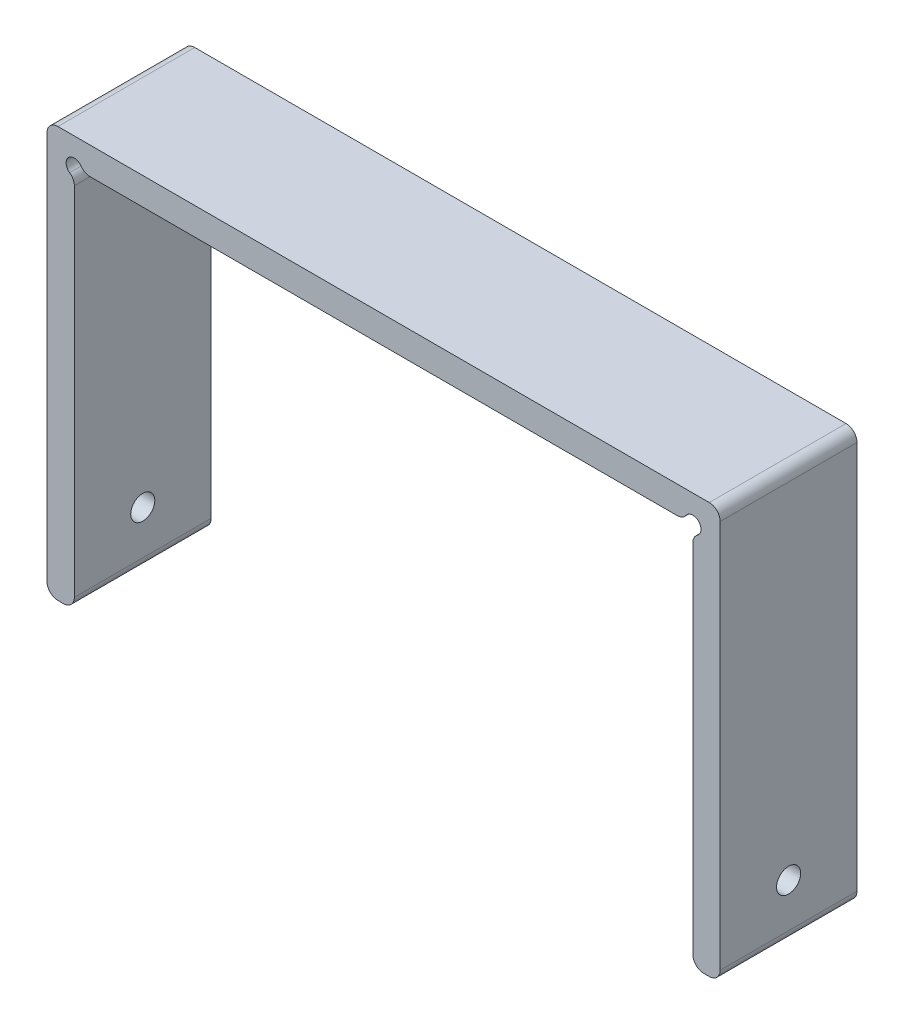
ISO-10303-21;
HEADER;
FILE_DESCRIPTION(('STEP AP214'),'2;1');
FILE_NAME('part.step','',(''),(''),'','','');
FILE_SCHEMA(('AUTOMOTIVE_DESIGN { 1 0 10303 214 1 1 1 1 }'));
ENDSEC;
DATA;
#1=APPLICATION_CONTEXT('core data for automotive mechanical design processes');
#2=APPLICATION_PROTOCOL_DEFINITION('international standard','automotive_design',2000,#1);
#3=PRODUCT_CONTEXT('',#1,'mechanical');
#4=PRODUCT('Part','Part','',(#3));
#5=PRODUCT_RELATED_PRODUCT_CATEGORY('part','',(#4));
#6=PRODUCT_DEFINITION_FORMATION('','',#4);
#7=PRODUCT_DEFINITION_CONTEXT('part definition',#1,'design');
#8=PRODUCT_DEFINITION('design','',#6,#7);
#9=PRODUCT_DEFINITION_SHAPE('','',#8);
#10=(LENGTH_UNIT() NAMED_UNIT(*) SI_UNIT(.MILLI.,.METRE.));
#11=(NAMED_UNIT(*) PLANE_ANGLE_UNIT() SI_UNIT($,.RADIAN.));
#12=(NAMED_UNIT(*) SI_UNIT($,.STERADIAN.) SOLID_ANGLE_UNIT());
#13=UNCERTAINTY_MEASURE_WITH_UNIT(LENGTH_MEASURE(1.E-05),#10,'distance_accuracy_value','');
#14=(GEOMETRIC_REPRESENTATION_CONTEXT(3) GLOBAL_UNCERTAINTY_ASSIGNED_CONTEXT((#13)) GLOBAL_UNIT_ASSIGNED_CONTEXT((#10,
#11,#12)) REPRESENTATION_CONTEXT('',''));
#15=CARTESIAN_POINT('',(0.,0.,0.));
#16=DIRECTION('',(0.,0.,1.));
#17=DIRECTION('',(1.,0.,0.));
#18=AXIS2_PLACEMENT_3D('',#15,#16,#17);
#19=CARTESIAN_POINT('',(0.,0.,25.));
#20=DIRECTION('',(0.,1.,0.));
#21=DIRECTION('',(-1.,0.,0.));
#22=AXIS2_PLACEMENT_3D('',#19,#20,#21);
#23=PLANE('',#22);
#24=DIRECTION('',(1.,0.,0.));
#25=VECTOR('',#24,1.);
#26=CARTESIAN_POINT('',(0.,0.,25.));
#27=LINE('',#26,#25);
#28=CARTESIAN_POINT('',(2.,0.,25.));
#29=VERTEX_POINT('',#28);
#30=CARTESIAN_POINT('',(3.,0.,25.));
#31=VERTEX_POINT('',#30);
#32=EDGE_CURVE('E226',#29,#31,#27,.T.);
#33=ORIENTED_EDGE('',*,*,#32,.F.);
#34=DIRECTION('',(0.,0.,-1.));
#35=VECTOR('',#34,1.);
#36=CARTESIAN_POINT('',(2.,0.,25.));
#37=LINE('',#36,#35);
#38=CARTESIAN_POINT('',(2.,0.,0.));
#39=VERTEX_POINT('',#38);
#40=EDGE_CURVE('E283',#29,#39,#37,.T.);
#41=ORIENTED_EDGE('',*,*,#40,.T.);
#42=DIRECTION('',(1.,0.,0.));
#43=VECTOR('',#42,1.);
#44=CARTESIAN_POINT('',(0.,0.,0.));
#45=LINE('',#44,#43);
#46=CARTESIAN_POINT('',(3.,0.,0.));
#47=VERTEX_POINT('',#46);
#48=EDGE_CURVE('E203',#39,#47,#45,.T.);
#49=ORIENTED_EDGE('',*,*,#48,.T.);
#50=DIRECTION('',(0.,0.,-1.));
#51=VECTOR('',#50,1.);
#52=CARTESIAN_POINT('',(3.,0.,25.));
#53=LINE('',#52,#51);
#54=EDGE_CURVE('E179',#47,#31,#53,.F.);
#55=ORIENTED_EDGE('',*,*,#54,.T.);
#56=EDGE_LOOP('',(#33,#41,#49,#55));
#57=FACE_BOUND('',#56,.T.);
#58=ADVANCED_FACE('F37',(#57),#23,.F.);
#59=CARTESIAN_POINT('',(5.,0.,25.));
#60=DIRECTION('',(-1.,0.,0.));
#61=DIRECTION('',(0.,-1.,0.));
#62=AXIS2_PLACEMENT_3D('',#59,#60,#61);
#63=PLANE('',#62);
#64=CARTESIAN_POINT('',(5.,10.,12.5));
#65=DIRECTION('',(-1.,0.,0.));
#66=DIRECTION('',(0.,-1.,0.));
#67=AXIS2_PLACEMENT_3D('',#64,#65,#66);
#68=CIRCLE('',#67,2.2);
#69=CARTESIAN_POINT('',(5.,7.8,12.5));
#70=VERTEX_POINT('',#69);
#71=EDGE_CURVE('E208',#70,#70,#68,.T.);
#72=ORIENTED_EDGE('',*,*,#71,.T.);
#73=EDGE_LOOP('',(#72));
#74=FACE_BOUND('',#73,.T.);
#75=DIRECTION('',(0.,1.,0.));
#76=VECTOR('',#75,1.);
#77=CARTESIAN_POINT('',(5.,0.,0.));
#78=LINE('',#77,#76);
#79=CARTESIAN_POINT('',(5.,2.,0.));
#80=VERTEX_POINT('',#79);
#81=CARTESIAN_POINT('',(4.99999999999999,67.127718676731,0.));
#82=VERTEX_POINT('',#81);
#83=EDGE_CURVE('E191',#80,#82,#78,.T.);
#84=ORIENTED_EDGE('',*,*,#83,.T.);
#85=DIRECTION('',(0.,0.,1.));
#86=VECTOR('',#85,1.);
#87=CARTESIAN_POINT('',(4.99999999999999,67.127718676731,25.));
#88=LINE('',#87,#86);
#89=CARTESIAN_POINT('',(4.99999999999999,67.127718676731,25.));
#90=VERTEX_POINT('',#89);
#91=EDGE_CURVE('E195',#82,#90,#88,.T.);
#92=ORIENTED_EDGE('',*,*,#91,.T.);
#93=DIRECTION('',(0.,1.,0.));
#94=VECTOR('',#93,1.);
#95=CARTESIAN_POINT('',(5.,0.,25.));
#96=LINE('',#95,#94);
#97=CARTESIAN_POINT('',(5.,2.,25.));
#98=VERTEX_POINT('',#97);
#99=EDGE_CURVE('E194',#98,#90,#96,.T.);
#100=ORIENTED_EDGE('',*,*,#99,.F.);
#101=DIRECTION('',(0.,0.,-1.));
#102=VECTOR('',#101,1.);
#103=CARTESIAN_POINT('',(5.,2.,25.));
#104=LINE('',#103,#102);
#105=EDGE_CURVE('E178',#98,#80,#104,.T.);
#106=ORIENTED_EDGE('',*,*,#105,.T.);
#107=EDGE_LOOP('',(#84,#92,#100,#106));
#108=FACE_BOUND('',#107,.T.);
#109=ADVANCED_FACE('F189',(#74,#108),#63,.F.);
#110=CARTESIAN_POINT('',(4.99999999999999,70.,25.));
#111=DIRECTION('',(0.,1.,0.));
#112=DIRECTION('',(0.,0.,1.));
#113=AXIS2_PLACEMENT_3D('',#110,#111,#112);
#114=PLANE('',#113);
#115=DIRECTION('',(1.,0.,0.));
#116=VECTOR('',#115,1.);
#117=CARTESIAN_POINT('',(4.99999999999999,70.,0.));
#118=LINE('',#117,#116);
#119=CARTESIAN_POINT('',(7.872281323269,70.,0.));
#120=VERTEX_POINT('',#119);
#121=CARTESIAN_POINT('',(115.127718676731,70.,0.));
#122=VERTEX_POINT('',#121);
#123=EDGE_CURVE('E202',#120,#122,#118,.T.);
#124=ORIENTED_EDGE('',*,*,#123,.T.);
#125=DIRECTION('',(0.,0.,1.));
#126=VECTOR('',#125,1.);
#127=CARTESIAN_POINT('',(115.127718676731,70.,25.));
#128=LINE('',#127,#126);
#129=CARTESIAN_POINT('',(115.127718676731,70.,25.));
#130=VERTEX_POINT('',#129);
#131=EDGE_CURVE('E271',#122,#130,#128,.T.);
#132=ORIENTED_EDGE('',*,*,#131,.T.);
#133=DIRECTION('',(1.,0.,0.));
#134=VECTOR('',#133,1.);
#135=CARTESIAN_POINT('',(4.99999999999999,70.,25.));
#136=LINE('',#135,#134);
#137=CARTESIAN_POINT('',(7.872281323269,70.,25.));
#138=VERTEX_POINT('',#137);
#139=EDGE_CURVE('E403',#138,#130,#136,.T.);
#140=ORIENTED_EDGE('',*,*,#139,.F.);
#141=DIRECTION('',(0.,0.,1.));
#142=VECTOR('',#141,1.);
#143=CARTESIAN_POINT('',(7.872281323269,70.,25.));
#144=LINE('',#143,#142);
#145=EDGE_CURVE('E268',#138,#120,#144,.F.);
#146=ORIENTED_EDGE('',*,*,#145,.T.);
#147=EDGE_LOOP('',(#124,#132,#140,#146));
#148=FACE_BOUND('',#147,.T.);
#149=ADVANCED_FACE('F371',(#148),#114,.F.);
#150=CARTESIAN_POINT('',(118.,70.,25.));
#151=DIRECTION('',(1.,0.,0.));
#152=DIRECTION('',(0.,0.,-1.));
#153=AXIS2_PLACEMENT_3D('',#150,#151,#152);
#154=PLANE('',#153);
#155=CARTESIAN_POINT('',(118.,10.,12.5));
#156=DIRECTION('',(1.,0.,0.));
#157=DIRECTION('',(0.,0.,-1.));
#158=AXIS2_PLACEMENT_3D('',#155,#156,#157);
#159=CIRCLE('',#158,2.2);
#160=CARTESIAN_POINT('',(118.,10.,10.3));
#161=VERTEX_POINT('',#160);
#162=EDGE_CURVE('E411',#161,#161,#159,.T.);
#163=ORIENTED_EDGE('',*,*,#162,.T.);
#164=EDGE_LOOP('',(#163));
#165=FACE_BOUND('',#164,.T.);
#166=DIRECTION('',(0.,-1.,0.));
#167=VECTOR('',#166,1.);
#168=CARTESIAN_POINT('',(118.,70.,25.));
#169=LINE('',#168,#167);
#170=CARTESIAN_POINT('',(118.,67.127718676731,25.));
#171=VERTEX_POINT('',#170);
#172=CARTESIAN_POINT('',(118.,2.,25.));
#173=VERTEX_POINT('',#172);
#174=EDGE_CURVE('E328',#171,#173,#169,.T.);
#175=ORIENTED_EDGE('',*,*,#174,.F.);
#176=DIRECTION('',(0.,0.,1.));
#177=VECTOR('',#176,1.);
#178=CARTESIAN_POINT('',(118.,67.127718676731,25.));
#179=LINE('',#178,#177);
#180=CARTESIAN_POINT('',(118.,67.127718676731,0.));
#181=VERTEX_POINT('',#180);
#182=EDGE_CURVE('E279',#171,#181,#179,.F.);
#183=ORIENTED_EDGE('',*,*,#182,.T.);
#184=DIRECTION('',(0.,-1.,0.));
#185=VECTOR('',#184,1.);
#186=CARTESIAN_POINT('',(118.,70.,0.));
#187=LINE('',#186,#185);
#188=CARTESIAN_POINT('',(118.,2.,0.));
#189=VERTEX_POINT('',#188);
#190=EDGE_CURVE('E206',#181,#189,#187,.T.);
#191=ORIENTED_EDGE('',*,*,#190,.T.);
#192=DIRECTION('',(0.,0.,-1.));
#193=VECTOR('',#192,1.);
#194=CARTESIAN_POINT('',(118.,2.,25.));
#195=LINE('',#194,#193);
#196=EDGE_CURVE('E277',#189,#173,#195,.F.);
#197=ORIENTED_EDGE('',*,*,#196,.T.);
#198=EDGE_LOOP('',(#175,#183,#191,#197));
#199=FACE_BOUND('',#198,.T.);
#200=ADVANCED_FACE('F401',(#165,#199),#154,.F.);
#201=CARTESIAN_POINT('',(123.,0.,25.));
#202=DIRECTION('',(0.,1.,0.));
#203=DIRECTION('',(-1.,0.,0.));
#204=AXIS2_PLACEMENT_3D('',#201,#202,#203);
#205=PLANE('',#204);
#206=DIRECTION('',(1.,0.,0.));
#207=VECTOR('',#206,1.);
#208=CARTESIAN_POINT('',(123.,0.,0.));
#209=LINE('',#208,#207);
#210=CARTESIAN_POINT('',(120.,0.,0.));
#211=VERTEX_POINT('',#210);
#212=CARTESIAN_POINT('',(121.,0.,0.));
#213=VERTEX_POINT('',#212);
#214=EDGE_CURVE('E214',#211,#213,#209,.T.);
#215=ORIENTED_EDGE('',*,*,#214,.T.);
#216=DIRECTION('',(0.,0.,-1.));
#217=VECTOR('',#216,1.);
#218=CARTESIAN_POINT('',(121.,0.,25.));
#219=LINE('',#218,#217);
#220=CARTESIAN_POINT('',(121.,0.,25.));
#221=VERTEX_POINT('',#220);
#222=EDGE_CURVE('E11',#213,#221,#219,.F.);
#223=ORIENTED_EDGE('',*,*,#222,.T.);
#224=DIRECTION('',(1.,0.,0.));
#225=VECTOR('',#224,1.);
#226=CARTESIAN_POINT('',(123.,0.,25.));
#227=LINE('',#226,#225);
#228=CARTESIAN_POINT('',(120.,0.,25.));
#229=VERTEX_POINT('',#228);
#230=EDGE_CURVE('E308',#229,#221,#227,.T.);
#231=ORIENTED_EDGE('',*,*,#230,.F.);
#232=DIRECTION('',(0.,0.,-1.));
#233=VECTOR('',#232,1.);
#234=CARTESIAN_POINT('',(120.,0.,25.));
#235=LINE('',#234,#233);
#236=EDGE_CURVE('E45',#229,#211,#235,.T.);
#237=ORIENTED_EDGE('',*,*,#236,.T.);
#238=EDGE_LOOP('',(#215,#223,#231,#237));
#239=FACE_BOUND('',#238,.T.);
#240=ADVANCED_FACE('F305',(#239),#205,.F.);
#241=CARTESIAN_POINT('',(123.,75.,25.));
#242=DIRECTION('',(-1.,0.,0.));
#243=DIRECTION('',(0.,0.,1.));
#244=AXIS2_PLACEMENT_3D('',#241,#242,#243);
#245=PLANE('',#244);
#246=CARTESIAN_POINT('',(123.,10.,12.5));
#247=DIRECTION('',(1.,0.,0.));
#248=DIRECTION('',(0.,0.,-1.));
#249=AXIS2_PLACEMENT_3D('',#246,#247,#248);
#250=CIRCLE('',#249,2.2);
#251=CARTESIAN_POINT('',(123.,10.,10.3));
#252=VERTEX_POINT('',#251);
#253=EDGE_CURVE('E415',#252,#252,#250,.T.);
#254=ORIENTED_EDGE('',*,*,#253,.F.);
#255=EDGE_LOOP('',(#254));
#256=FACE_BOUND('',#255,.T.);
#257=DIRECTION('',(0.,1.,0.));
#258=VECTOR('',#257,1.);
#259=CARTESIAN_POINT('',(123.,75.,0.));
#260=LINE('',#259,#258);
#261=CARTESIAN_POINT('',(123.,2.,0.));
#262=VERTEX_POINT('',#261);
#263=CARTESIAN_POINT('',(123.,73.,0.));
#264=VERTEX_POINT('',#263);
#265=EDGE_CURVE('E217',#262,#264,#260,.T.);
#266=ORIENTED_EDGE('',*,*,#265,.T.);
#267=DIRECTION('',(0.,0.,-1.));
#268=VECTOR('',#267,1.);
#269=CARTESIAN_POINT('',(123.,73.,25.));
#270=LINE('',#269,#268);
#271=CARTESIAN_POINT('',(123.,73.,25.));
#272=VERTEX_POINT('',#271);
#273=EDGE_CURVE('E299',#264,#272,#270,.F.);
#274=ORIENTED_EDGE('',*,*,#273,.T.);
#275=DIRECTION('',(0.,1.,0.));
#276=VECTOR('',#275,1.);
#277=CARTESIAN_POINT('',(123.,75.,25.));
#278=LINE('',#277,#276);
#279=CARTESIAN_POINT('',(123.,2.,25.));
#280=VERTEX_POINT('',#279);
#281=EDGE_CURVE('E321',#280,#272,#278,.T.);
#282=ORIENTED_EDGE('',*,*,#281,.F.);
#283=DIRECTION('',(0.,0.,-1.));
#284=VECTOR('',#283,1.);
#285=CARTESIAN_POINT('',(123.,2.,25.));
#286=LINE('',#285,#284);
#287=EDGE_CURVE('E296',#280,#262,#286,.T.);
#288=ORIENTED_EDGE('',*,*,#287,.T.);
#289=EDGE_LOOP('',(#266,#274,#282,#288));
#290=FACE_BOUND('',#289,.T.);
#291=ADVANCED_FACE('F318',(#256,#290),#245,.F.);
#292=CARTESIAN_POINT('',(0.,75.,25.));
#293=DIRECTION('',(0.,-1.,0.));
#294=DIRECTION('',(0.,0.,-1.));
#295=AXIS2_PLACEMENT_3D('',#292,#293,#294);
#296=PLANE('',#295);
#297=DIRECTION('',(-1.,0.,0.));
#298=VECTOR('',#297,1.);
#299=CARTESIAN_POINT('',(0.,75.,25.));
#300=LINE('',#299,#298);
#301=CARTESIAN_POINT('',(121.,75.,25.));
#302=VERTEX_POINT('',#301);
#303=CARTESIAN_POINT('',(1.99999999999999,75.,25.));
#304=VERTEX_POINT('',#303);
#305=EDGE_CURVE('E324',#302,#304,#300,.T.);
#306=ORIENTED_EDGE('',*,*,#305,.F.);
#307=DIRECTION('',(0.,0.,-1.));
#308=VECTOR('',#307,1.);
#309=CARTESIAN_POINT('',(121.,75.,25.));
#310=LINE('',#309,#308);
#311=CARTESIAN_POINT('',(121.,75.,0.));
#312=VERTEX_POINT('',#311);
#313=EDGE_CURVE('E293',#302,#312,#310,.T.);
#314=ORIENTED_EDGE('',*,*,#313,.T.);
#315=DIRECTION('',(-1.,0.,0.));
#316=VECTOR('',#315,1.);
#317=CARTESIAN_POINT('',(0.,75.,0.));
#318=LINE('',#317,#316);
#319=CARTESIAN_POINT('',(1.99999999999999,75.,0.));
#320=VERTEX_POINT('',#319);
#321=EDGE_CURVE('E220',#312,#320,#318,.T.);
#322=ORIENTED_EDGE('',*,*,#321,.T.);
#323=DIRECTION('',(0.,0.,-1.));
#324=VECTOR('',#323,1.);
#325=CARTESIAN_POINT('',(1.99999999999999,75.,25.));
#326=LINE('',#325,#324);
#327=EDGE_CURVE('E291',#320,#304,#326,.F.);
#328=ORIENTED_EDGE('',*,*,#327,.T.);
#329=EDGE_LOOP('',(#306,#314,#322,#328));
#330=FACE_BOUND('',#329,.T.);
#331=ADVANCED_FACE('F352',(#330),#296,.F.);
#332=CARTESIAN_POINT('',(0.,0.,25.));
#333=DIRECTION('',(1.,0.,0.));
#334=DIRECTION('',(0.,1.,0.));
#335=AXIS2_PLACEMENT_3D('',#332,#333,#334);
#336=PLANE('',#335);
#337=CARTESIAN_POINT('',(0.,10.,12.5));
#338=DIRECTION('',(1.,0.,0.));
#339=DIRECTION('',(0.,0.,-1.));
#340=AXIS2_PLACEMENT_3D('',#337,#338,#339);
#341=CIRCLE('',#340,2.2);
#342=CARTESIAN_POINT('',(0.,10.,10.3));
#343=VERTEX_POINT('',#342);
#344=EDGE_CURVE('E414',#343,#343,#341,.T.);
#345=ORIENTED_EDGE('',*,*,#344,.T.);
#346=EDGE_LOOP('',(#345));
#347=FACE_BOUND('',#346,.T.);
#348=DIRECTION('',(0.,-1.,0.));
#349=VECTOR('',#348,1.);
#350=CARTESIAN_POINT('',(0.,0.,0.));
#351=LINE('',#350,#349);
#352=CARTESIAN_POINT('',(0.,73.,0.));
#353=VERTEX_POINT('',#352);
#354=CARTESIAN_POINT('',(0.,2.,0.));
#355=VERTEX_POINT('',#354);
#356=EDGE_CURVE('E223',#353,#355,#351,.T.);
#357=ORIENTED_EDGE('',*,*,#356,.T.);
#358=DIRECTION('',(0.,0.,-1.));
#359=VECTOR('',#358,1.);
#360=CARTESIAN_POINT('',(0.,2.,25.));
#361=LINE('',#360,#359);
#362=CARTESIAN_POINT('',(0.,2.,25.));
#363=VERTEX_POINT('',#362);
#364=EDGE_CURVE('E289',#355,#363,#361,.F.);
#365=ORIENTED_EDGE('',*,*,#364,.T.);
#366=DIRECTION('',(0.,-1.,0.));
#367=VECTOR('',#366,1.);
#368=CARTESIAN_POINT('',(0.,0.,25.));
#369=LINE('',#368,#367);
#370=CARTESIAN_POINT('',(0.,73.,25.));
#371=VERTEX_POINT('',#370);
#372=EDGE_CURVE('E227',#371,#363,#369,.T.);
#373=ORIENTED_EDGE('',*,*,#372,.F.);
#374=DIRECTION('',(0.,0.,-1.));
#375=VECTOR('',#374,1.);
#376=CARTESIAN_POINT('',(0.,73.,25.));
#377=LINE('',#376,#375);
#378=EDGE_CURVE('E286',#371,#353,#377,.T.);
#379=ORIENTED_EDGE('',*,*,#378,.T.);
#380=EDGE_LOOP('',(#357,#365,#373,#379));
#381=FACE_BOUND('',#380,.T.);
#382=ADVANCED_FACE('F346',(#347,#381),#336,.F.);
#383=CARTESIAN_POINT('',(0.,0.,25.));
#384=DIRECTION('',(0.,0.,1.));
#385=DIRECTION('',(1.,0.,0.));
#386=AXIS2_PLACEMENT_3D('',#383,#384,#385);
#387=PLANE('',#386);
#388=ORIENTED_EDGE('',*,*,#99,.T.);
#389=CARTESIAN_POINT('',(2.99999999999999,67.127718676731,25.));
#390=DIRECTION('',(0.,0.,1.));
#391=DIRECTION('',(1.,0.,0.));
#392=AXIS2_PLACEMENT_3D('',#389,#390,#391);
#393=CIRCLE('',#392,2.);
#394=CARTESIAN_POINT('',(4.14285714285713,68.7690222900276,25.));
#395=VERTEX_POINT('',#394);
#396=EDGE_CURVE('E248',#90,#395,#393,.T.);
#397=ORIENTED_EDGE('',*,*,#396,.T.);
#398=CARTESIAN_POINT('',(4.99999999999999,70.,25.));
#399=DIRECTION('',(0.,0.,1.));
#400=DIRECTION('',(1.,0.,0.));
#401=AXIS2_PLACEMENT_3D('',#398,#399,#400);
#402=CIRCLE('',#401,1.5);
#403=CARTESIAN_POINT('',(6.23097770997242,70.8571428571429,25.));
#404=VERTEX_POINT('',#403);
#405=EDGE_CURVE('E422',#404,#395,#402,.T.);
#406=ORIENTED_EDGE('',*,*,#405,.F.);
#407=CARTESIAN_POINT('',(7.872281323269,72.,25.));
#408=DIRECTION('',(0.,0.,1.));
#409=DIRECTION('',(1.,0.,0.));
#410=AXIS2_PLACEMENT_3D('',#407,#408,#409);
#411=CIRCLE('',#410,2.);
#412=EDGE_CURVE('E244',#404,#138,#411,.T.);
#413=ORIENTED_EDGE('',*,*,#412,.T.);
#414=ORIENTED_EDGE('',*,*,#139,.T.);
#415=CARTESIAN_POINT('',(115.127718676731,72.,25.));
#416=DIRECTION('',(0.,0.,1.));
#417=DIRECTION('',(1.,0.,0.));
#418=AXIS2_PLACEMENT_3D('',#415,#416,#417);
#419=CIRCLE('',#418,2.);
#420=CARTESIAN_POINT('',(116.769022290028,70.8571428571429,25.));
#421=VERTEX_POINT('',#420);
#422=EDGE_CURVE('E246',#130,#421,#419,.T.);
#423=ORIENTED_EDGE('',*,*,#422,.T.);
#424=CARTESIAN_POINT('',(118.,70.,25.));
#425=DIRECTION('',(0.,0.,1.));
#426=DIRECTION('',(1.,0.,0.));
#427=AXIS2_PLACEMENT_3D('',#424,#425,#426);
#428=CIRCLE('',#427,1.5);
#429=CARTESIAN_POINT('',(118.857142857143,68.7690222900276,25.));
#430=VERTEX_POINT('',#429);
#431=EDGE_CURVE('E399',#430,#421,#428,.T.);
#432=ORIENTED_EDGE('',*,*,#431,.F.);
#433=CARTESIAN_POINT('',(120.,67.127718676731,25.));
#434=DIRECTION('',(0.,0.,1.));
#435=DIRECTION('',(1.,0.,0.));
#436=AXIS2_PLACEMENT_3D('',#433,#434,#435);
#437=CIRCLE('',#436,2.);
#438=EDGE_CURVE('E242',#430,#171,#437,.T.);
#439=ORIENTED_EDGE('',*,*,#438,.T.);
#440=ORIENTED_EDGE('',*,*,#174,.T.);
#441=CARTESIAN_POINT('',(120.,2.,25.));
#442=DIRECTION('',(0.,0.,1.));
#443=DIRECTION('',(1.,0.,0.));
#444=AXIS2_PLACEMENT_3D('',#441,#442,#443);
#445=CIRCLE('',#444,2.);
#446=EDGE_CURVE('E234',#173,#229,#445,.T.);
#447=ORIENTED_EDGE('',*,*,#446,.T.);
#448=ORIENTED_EDGE('',*,*,#230,.T.);
#449=CARTESIAN_POINT('',(121.,2.,25.));
#450=DIRECTION('',(0.,0.,1.));
#451=DIRECTION('',(1.,0.,0.));
#452=AXIS2_PLACEMENT_3D('',#449,#450,#451);
#453=CIRCLE('',#452,2.);
#454=EDGE_CURVE('E236',#221,#280,#453,.T.);
#455=ORIENTED_EDGE('',*,*,#454,.T.);
#456=ORIENTED_EDGE('',*,*,#281,.T.);
#457=CARTESIAN_POINT('',(121.,73.,25.));
#458=DIRECTION('',(0.,0.,1.));
#459=DIRECTION('',(1.,0.,0.));
#460=AXIS2_PLACEMENT_3D('',#457,#458,#459);
#461=CIRCLE('',#460,2.);
#462=EDGE_CURVE('E238',#272,#302,#461,.T.);
#463=ORIENTED_EDGE('',*,*,#462,.T.);
#464=ORIENTED_EDGE('',*,*,#305,.T.);
#465=CARTESIAN_POINT('',(1.99999999999999,73.,25.));
#466=DIRECTION('',(0.,0.,1.));
#467=DIRECTION('',(1.,0.,0.));
#468=AXIS2_PLACEMENT_3D('',#465,#466,#467);
#469=CIRCLE('',#468,2.);
#470=EDGE_CURVE('E230',#304,#371,#469,.T.);
#471=ORIENTED_EDGE('',*,*,#470,.T.);
#472=ORIENTED_EDGE('',*,*,#372,.T.);
#473=CARTESIAN_POINT('',(2.,2.,25.));
#474=DIRECTION('',(0.,0.,1.));
#475=DIRECTION('',(1.,0.,0.));
#476=AXIS2_PLACEMENT_3D('',#473,#474,#475);
#477=CIRCLE('',#476,2.);
#478=EDGE_CURVE('E240',#363,#29,#477,.T.);
#479=ORIENTED_EDGE('',*,*,#478,.T.);
#480=ORIENTED_EDGE('',*,*,#32,.T.);
#481=CARTESIAN_POINT('',(3.,2.,25.));
#482=DIRECTION('',(0.,0.,1.));
#483=DIRECTION('',(1.,0.,0.));
#484=AXIS2_PLACEMENT_3D('',#481,#482,#483);
#485=CIRCLE('',#484,2.);
#486=EDGE_CURVE('E232',#31,#98,#485,.T.);
#487=ORIENTED_EDGE('',*,*,#486,.T.);
#488=EDGE_LOOP('',(#388,#397,#406,#413,#414,#423,#432,#439,#440,#447,#448,#455,#456,#463,#464,
#471,#472,#479,#480,#487));
#489=FACE_BOUND('',#488,.T.);
#490=ADVANCED_FACE('F334',(#489),#387,.T.);
#491=CARTESIAN_POINT('',(0.,0.,0.));
#492=DIRECTION('',(0.,0.,1.));
#493=DIRECTION('',(1.,0.,0.));
#494=AXIS2_PLACEMENT_3D('',#491,#492,#493);
#495=PLANE('',#494);
#496=CARTESIAN_POINT('',(4.99999999999999,70.,0.));
#497=DIRECTION('',(0.,0.,1.));
#498=DIRECTION('',(1.,0.,0.));
#499=AXIS2_PLACEMENT_3D('',#496,#497,#498);
#500=CIRCLE('',#499,1.5);
#501=CARTESIAN_POINT('',(6.23097770997242,70.8571428571429,0.));
#502=VERTEX_POINT('',#501);
#503=CARTESIAN_POINT('',(4.14285714285713,68.7690222900276,0.));
#504=VERTEX_POINT('',#503);
#505=EDGE_CURVE('E418',#502,#504,#500,.T.);
#506=ORIENTED_EDGE('',*,*,#505,.T.);
#507=CARTESIAN_POINT('',(2.99999999999999,67.127718676731,0.));
#508=DIRECTION('',(0.,0.,1.));
#509=DIRECTION('',(1.,0.,0.));
#510=AXIS2_PLACEMENT_3D('',#507,#508,#509);
#511=CIRCLE('',#510,2.);
#512=EDGE_CURVE('E201',#504,#82,#511,.F.);
#513=ORIENTED_EDGE('',*,*,#512,.T.);
#514=ORIENTED_EDGE('',*,*,#83,.F.);
#515=CARTESIAN_POINT('',(3.,2.,0.));
#516=DIRECTION('',(0.,0.,1.));
#517=DIRECTION('',(1.,0.,0.));
#518=AXIS2_PLACEMENT_3D('',#515,#516,#517);
#519=CIRCLE('',#518,2.);
#520=EDGE_CURVE('E174',#80,#47,#519,.F.);
#521=ORIENTED_EDGE('',*,*,#520,.T.);
#522=ORIENTED_EDGE('',*,*,#48,.F.);
#523=CARTESIAN_POINT('',(2.,2.,0.));
#524=DIRECTION('',(0.,0.,1.));
#525=DIRECTION('',(1.,0.,0.));
#526=AXIS2_PLACEMENT_3D('',#523,#524,#525);
#527=CIRCLE('',#526,2.);
#528=EDGE_CURVE('E260',#39,#355,#527,.F.);
#529=ORIENTED_EDGE('',*,*,#528,.T.);
#530=ORIENTED_EDGE('',*,*,#356,.F.);
#531=CARTESIAN_POINT('',(1.99999999999999,73.,0.));
#532=DIRECTION('',(0.,0.,1.));
#533=DIRECTION('',(1.,0.,0.));
#534=AXIS2_PLACEMENT_3D('',#531,#532,#533);
#535=CIRCLE('',#534,2.);
#536=EDGE_CURVE('E184',#353,#320,#535,.F.);
#537=ORIENTED_EDGE('',*,*,#536,.T.);
#538=ORIENTED_EDGE('',*,*,#321,.F.);
#539=CARTESIAN_POINT('',(121.,73.,0.));
#540=DIRECTION('',(0.,0.,1.));
#541=DIRECTION('',(1.,0.,0.));
#542=AXIS2_PLACEMENT_3D('',#539,#540,#541);
#543=CIRCLE('',#542,2.);
#544=EDGE_CURVE('E258',#312,#264,#543,.F.);
#545=ORIENTED_EDGE('',*,*,#544,.T.);
#546=ORIENTED_EDGE('',*,*,#265,.F.);
#547=CARTESIAN_POINT('',(121.,2.,0.));
#548=DIRECTION('',(0.,0.,1.));
#549=DIRECTION('',(1.,0.,0.));
#550=AXIS2_PLACEMENT_3D('',#547,#548,#549);
#551=CIRCLE('',#550,2.);
#552=EDGE_CURVE('E256',#262,#213,#551,.F.);
#553=ORIENTED_EDGE('',*,*,#552,.T.);
#554=ORIENTED_EDGE('',*,*,#214,.F.);
#555=CARTESIAN_POINT('',(120.,2.,0.));
#556=DIRECTION('',(0.,0.,1.));
#557=DIRECTION('',(1.,0.,0.));
#558=AXIS2_PLACEMENT_3D('',#555,#556,#557);
#559=CIRCLE('',#558,2.);
#560=EDGE_CURVE('E183',#211,#189,#559,.F.);
#561=ORIENTED_EDGE('',*,*,#560,.T.);
#562=ORIENTED_EDGE('',*,*,#190,.F.);
#563=CARTESIAN_POINT('',(120.,67.127718676731,0.));
#564=DIRECTION('',(0.,0.,1.));
#565=DIRECTION('',(1.,0.,0.));
#566=AXIS2_PLACEMENT_3D('',#563,#564,#565);
#567=CIRCLE('',#566,2.);
#568=CARTESIAN_POINT('',(118.857142857143,68.7690222900276,0.));
#569=VERTEX_POINT('',#568);
#570=EDGE_CURVE('E59',#181,#569,#567,.F.);
#571=ORIENTED_EDGE('',*,*,#570,.T.);
#572=CARTESIAN_POINT('',(118.,70.,0.));
#573=DIRECTION('',(0.,0.,1.));
#574=DIRECTION('',(1.,0.,0.));
#575=AXIS2_PLACEMENT_3D('',#572,#573,#574);
#576=CIRCLE('',#575,1.5);
#577=CARTESIAN_POINT('',(116.769022290028,70.8571428571429,0.));
#578=VERTEX_POINT('',#577);
#579=EDGE_CURVE('E196',#569,#578,#576,.T.);
#580=ORIENTED_EDGE('',*,*,#579,.T.);
#581=CARTESIAN_POINT('',(115.127718676731,72.,0.));
#582=DIRECTION('',(0.,0.,1.));
#583=DIRECTION('',(1.,0.,0.));
#584=AXIS2_PLACEMENT_3D('',#581,#582,#583);
#585=CIRCLE('',#584,2.);
#586=EDGE_CURVE('E265',#578,#122,#585,.F.);
#587=ORIENTED_EDGE('',*,*,#586,.T.);
#588=ORIENTED_EDGE('',*,*,#123,.F.);
#589=CARTESIAN_POINT('',(7.872281323269,72.,0.));
#590=DIRECTION('',(0.,0.,1.));
#591=DIRECTION('',(1.,0.,0.));
#592=AXIS2_PLACEMENT_3D('',#589,#590,#591);
#593=CIRCLE('',#592,2.);
#594=EDGE_CURVE('E263',#120,#502,#593,.F.);
#595=ORIENTED_EDGE('',*,*,#594,.T.);
#596=EDGE_LOOP('',(#506,#513,#514,#521,#522,#529,#530,#537,#538,#545,#546,#553,#554,#561,#562,
#571,#580,#587,#588,#595));
#597=FACE_BOUND('',#596,.T.);
#598=ADVANCED_FACE('F199',(#597),#495,.F.);
#599=CARTESIAN_POINT('',(0.,10.,12.5));
#600=DIRECTION('',(1.,0.,0.));
#601=DIRECTION('',(0.,0.,-1.));
#602=AXIS2_PLACEMENT_3D('',#599,#600,#601);
#603=CYLINDRICAL_SURFACE('',#602,2.2);
#604=ORIENTED_EDGE('',*,*,#344,.F.);
#605=EDGE_LOOP('',(#604));
#606=FACE_BOUND('',#605,.T.);
#607=ORIENTED_EDGE('',*,*,#71,.F.);
#608=EDGE_LOOP('',(#607));
#609=FACE_BOUND('',#608,.T.);
#610=ADVANCED_FACE('F446',(#606,#609),#603,.F.);
#611=ORIENTED_EDGE('',*,*,#253,.T.);
#612=EDGE_LOOP('',(#611));
#613=FACE_BOUND('',#612,.T.);
#614=ORIENTED_EDGE('',*,*,#162,.F.);
#615=EDGE_LOOP('',(#614));
#616=FACE_BOUND('',#615,.T.);
#617=ADVANCED_FACE('F439',(#613,#616),#603,.F.);
#618=CARTESIAN_POINT('',(118.,70.,0.));
#619=DIRECTION('',(0.,0.,1.));
#620=DIRECTION('',(1.,0.,0.));
#621=AXIS2_PLACEMENT_3D('',#618,#619,#620);
#622=CYLINDRICAL_SURFACE('',#621,1.5);
#623=ORIENTED_EDGE('',*,*,#431,.T.);
#624=DIRECTION('',(0.,0.,1.));
#625=VECTOR('',#624,1.);
#626=CARTESIAN_POINT('',(116.769022290028,70.8571428571429,0.));
#627=LINE('',#626,#625);
#628=EDGE_CURVE('E52',#421,#578,#627,.F.);
#629=ORIENTED_EDGE('',*,*,#628,.T.);
#630=ORIENTED_EDGE('',*,*,#579,.F.);
#631=DIRECTION('',(0.,0.,1.));
#632=VECTOR('',#631,1.);
#633=CARTESIAN_POINT('',(118.857142857143,68.7690222900276,0.));
#634=LINE('',#633,#632);
#635=EDGE_CURVE('E274',#569,#430,#634,.T.);
#636=ORIENTED_EDGE('',*,*,#635,.T.);
#637=EDGE_LOOP('',(#623,#629,#630,#636));
#638=FACE_BOUND('',#637,.T.);
#639=ADVANCED_FACE('F437',(#638),#622,.F.);
#640=CARTESIAN_POINT('',(4.99999999999999,70.,0.));
#641=DIRECTION('',(0.,0.,1.));
#642=DIRECTION('',(1.,0.,0.));
#643=AXIS2_PLACEMENT_3D('',#640,#641,#642);
#644=CYLINDRICAL_SURFACE('',#643,1.5);
#645=ORIENTED_EDGE('',*,*,#405,.T.);
#646=DIRECTION('',(0.,0.,1.));
#647=VECTOR('',#646,1.);
#648=CARTESIAN_POINT('',(4.14285714285713,68.7690222900276,0.));
#649=LINE('',#648,#647);
#650=EDGE_CURVE('E252',#395,#504,#649,.F.);
#651=ORIENTED_EDGE('',*,*,#650,.T.);
#652=ORIENTED_EDGE('',*,*,#505,.F.);
#653=DIRECTION('',(0.,0.,1.));
#654=VECTOR('',#653,1.);
#655=CARTESIAN_POINT('',(6.23097770997242,70.8571428571429,0.));
#656=LINE('',#655,#654);
#657=EDGE_CURVE('E250',#502,#404,#656,.T.);
#658=ORIENTED_EDGE('',*,*,#657,.T.);
#659=EDGE_LOOP('',(#645,#651,#652,#658));
#660=FACE_BOUND('',#659,.T.);
#661=ADVANCED_FACE('F380',(#660),#644,.F.);
#662=CARTESIAN_POINT('',(2.99999999999999,67.127718676731,0.));
#663=DIRECTION('',(0.,0.,1.));
#664=DIRECTION('',(1.,0.,0.));
#665=AXIS2_PLACEMENT_3D('',#662,#663,#664);
#666=CYLINDRICAL_SURFACE('',#665,2.);
#667=ORIENTED_EDGE('',*,*,#512,.F.);
#668=ORIENTED_EDGE('',*,*,#650,.F.);
#669=ORIENTED_EDGE('',*,*,#396,.F.);
#670=ORIENTED_EDGE('',*,*,#91,.F.);
#671=EDGE_LOOP('',(#667,#668,#669,#670));
#672=FACE_BOUND('',#671,.T.);
#673=ADVANCED_FACE('F376',(#672),#666,.T.);
#674=CARTESIAN_POINT('',(115.127718676731,72.,0.));
#675=DIRECTION('',(0.,0.,1.));
#676=DIRECTION('',(1.,0.,0.));
#677=AXIS2_PLACEMENT_3D('',#674,#675,#676);
#678=CYLINDRICAL_SURFACE('',#677,2.);
#679=ORIENTED_EDGE('',*,*,#586,.F.);
#680=ORIENTED_EDGE('',*,*,#628,.F.);
#681=ORIENTED_EDGE('',*,*,#422,.F.);
#682=ORIENTED_EDGE('',*,*,#131,.F.);
#683=EDGE_LOOP('',(#679,#680,#681,#682));
#684=FACE_BOUND('',#683,.T.);
#685=ADVANCED_FACE('F379',(#684),#678,.T.);
#686=CARTESIAN_POINT('',(7.872281323269,72.,0.));
#687=DIRECTION('',(0.,0.,1.));
#688=DIRECTION('',(1.,0.,0.));
#689=AXIS2_PLACEMENT_3D('',#686,#687,#688);
#690=CYLINDRICAL_SURFACE('',#689,2.);
#691=ORIENTED_EDGE('',*,*,#412,.F.);
#692=ORIENTED_EDGE('',*,*,#657,.F.);
#693=ORIENTED_EDGE('',*,*,#594,.F.);
#694=ORIENTED_EDGE('',*,*,#145,.F.);
#695=EDGE_LOOP('',(#691,#692,#693,#694));
#696=FACE_BOUND('',#695,.T.);
#697=ADVANCED_FACE('F384',(#696),#690,.T.);
#698=CARTESIAN_POINT('',(120.,67.127718676731,0.));
#699=DIRECTION('',(0.,0.,1.));
#700=DIRECTION('',(1.,0.,0.));
#701=AXIS2_PLACEMENT_3D('',#698,#699,#700);
#702=CYLINDRICAL_SURFACE('',#701,2.);
#703=ORIENTED_EDGE('',*,*,#438,.F.);
#704=ORIENTED_EDGE('',*,*,#635,.F.);
#705=ORIENTED_EDGE('',*,*,#570,.F.);
#706=ORIENTED_EDGE('',*,*,#182,.F.);
#707=EDGE_LOOP('',(#703,#704,#705,#706));
#708=FACE_BOUND('',#707,.T.);
#709=ADVANCED_FACE('F364',(#708),#702,.T.);
#710=CARTESIAN_POINT('',(2.,2.,25.));
#711=DIRECTION('',(0.,0.,-1.));
#712=DIRECTION('',(-1.,0.,0.));
#713=AXIS2_PLACEMENT_3D('',#710,#711,#712);
#714=CYLINDRICAL_SURFACE('',#713,2.);
#715=ORIENTED_EDGE('',*,*,#478,.F.);
#716=ORIENTED_EDGE('',*,*,#364,.F.);
#717=ORIENTED_EDGE('',*,*,#528,.F.);
#718=ORIENTED_EDGE('',*,*,#40,.F.);
#719=EDGE_LOOP('',(#715,#716,#717,#718));
#720=FACE_BOUND('',#719,.T.);
#721=ADVANCED_FACE('F343',(#720),#714,.T.);
#722=CARTESIAN_POINT('',(121.,73.,25.));
#723=DIRECTION('',(0.,0.,-1.));
#724=DIRECTION('',(-1.,0.,0.));
#725=AXIS2_PLACEMENT_3D('',#722,#723,#724);
#726=CYLINDRICAL_SURFACE('',#725,2.);
#727=ORIENTED_EDGE('',*,*,#462,.F.);
#728=ORIENTED_EDGE('',*,*,#273,.F.);
#729=ORIENTED_EDGE('',*,*,#544,.F.);
#730=ORIENTED_EDGE('',*,*,#313,.F.);
#731=EDGE_LOOP('',(#727,#728,#729,#730));
#732=FACE_BOUND('',#731,.T.);
#733=ADVANCED_FACE('F355',(#732),#726,.T.);
#734=CARTESIAN_POINT('',(121.,2.,25.));
#735=DIRECTION('',(0.,0.,-1.));
#736=DIRECTION('',(-1.,0.,0.));
#737=AXIS2_PLACEMENT_3D('',#734,#735,#736);
#738=CYLINDRICAL_SURFACE('',#737,2.);
#739=ORIENTED_EDGE('',*,*,#454,.F.);
#740=ORIENTED_EDGE('',*,*,#222,.F.);
#741=ORIENTED_EDGE('',*,*,#552,.F.);
#742=ORIENTED_EDGE('',*,*,#287,.F.);
#743=EDGE_LOOP('',(#739,#740,#741,#742));
#744=FACE_BOUND('',#743,.T.);
#745=ADVANCED_FACE('F315',(#744),#738,.T.);
#746=CARTESIAN_POINT('',(120.,2.,25.));
#747=DIRECTION('',(0.,0.,-1.));
#748=DIRECTION('',(-1.,0.,0.));
#749=AXIS2_PLACEMENT_3D('',#746,#747,#748);
#750=CYLINDRICAL_SURFACE('',#749,2.);
#751=ORIENTED_EDGE('',*,*,#446,.F.);
#752=ORIENTED_EDGE('',*,*,#196,.F.);
#753=ORIENTED_EDGE('',*,*,#560,.F.);
#754=ORIENTED_EDGE('',*,*,#236,.F.);
#755=EDGE_LOOP('',(#751,#752,#753,#754));
#756=FACE_BOUND('',#755,.T.);
#757=ADVANCED_FACE('F362',(#756),#750,.T.);
#758=CARTESIAN_POINT('',(3.,2.,25.));
#759=DIRECTION('',(0.,0.,-1.));
#760=DIRECTION('',(-1.,0.,0.));
#761=AXIS2_PLACEMENT_3D('',#758,#759,#760);
#762=CYLINDRICAL_SURFACE('',#761,2.);
#763=ORIENTED_EDGE('',*,*,#486,.F.);
#764=ORIENTED_EDGE('',*,*,#54,.F.);
#765=ORIENTED_EDGE('',*,*,#520,.F.);
#766=ORIENTED_EDGE('',*,*,#105,.F.);
#767=EDGE_LOOP('',(#763,#764,#765,#766));
#768=FACE_BOUND('',#767,.T.);
#769=ADVANCED_FACE('F177',(#768),#762,.T.);
#770=CARTESIAN_POINT('',(1.99999999999999,73.,25.));
#771=DIRECTION('',(0.,0.,-1.));
#772=DIRECTION('',(-1.,0.,0.));
#773=AXIS2_PLACEMENT_3D('',#770,#771,#772);
#774=CYLINDRICAL_SURFACE('',#773,2.);
#775=ORIENTED_EDGE('',*,*,#470,.F.);
#776=ORIENTED_EDGE('',*,*,#327,.F.);
#777=ORIENTED_EDGE('',*,*,#536,.F.);
#778=ORIENTED_EDGE('',*,*,#378,.F.);
#779=EDGE_LOOP('',(#775,#776,#777,#778));
#780=FACE_BOUND('',#779,.T.);
#781=ADVANCED_FACE('F39',(#780),#774,.T.);
#782=CLOSED_SHELL('',(#58,#109,#149,#200,#240,#291,#331,#382,#490,#598,#610,#617,#639,#661,#673,
#685,#697,#709,#721,#733,#745,#757,#769,#781));
#783=MANIFOLD_SOLID_BREP('B2',#782);
#784=ADVANCED_BREP_SHAPE_REPRESENTATION('',(#18,#783),#14);
#785=SHAPE_DEFINITION_REPRESENTATION(#9,#784);
ENDSEC;
END-ISO-10303-21;
